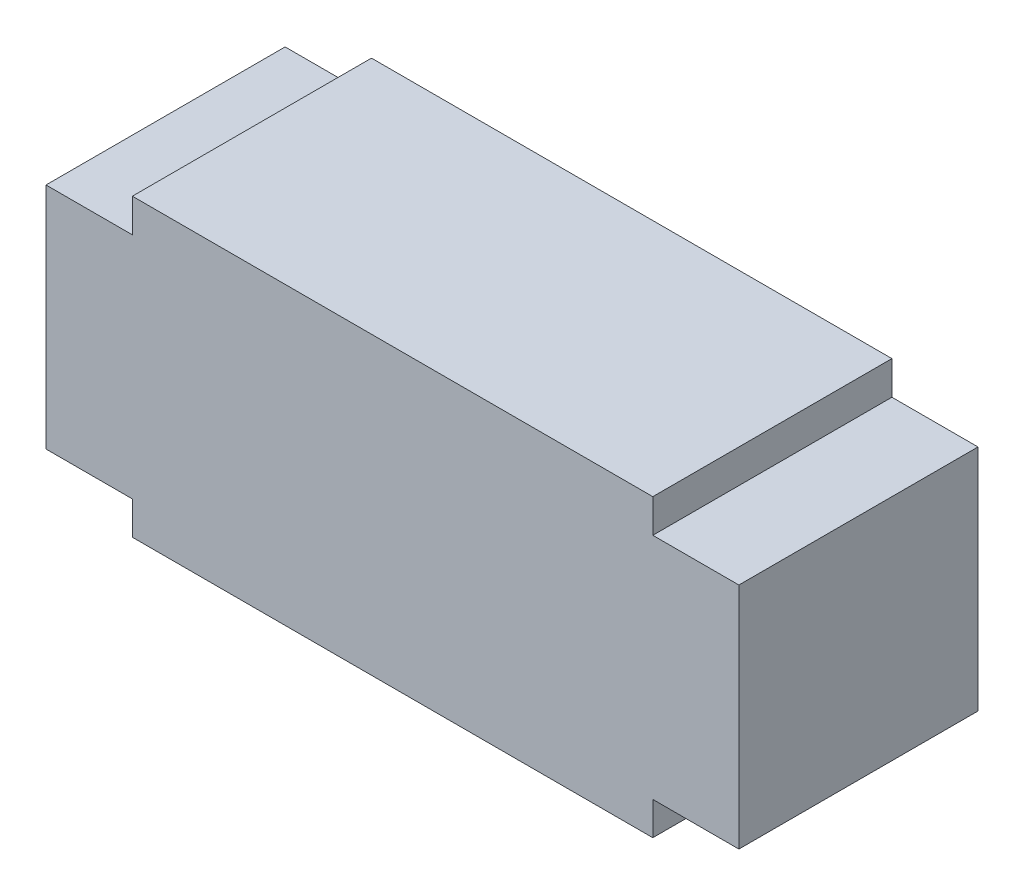
ISO-10303-21;
HEADER;
FILE_DESCRIPTION(('STEP AP214'),'2;1');
FILE_NAME('part.step','',(''),(''),'','','');
FILE_SCHEMA(('AUTOMOTIVE_DESIGN { 1 0 10303 214 1 1 1 1 }'));
ENDSEC;
DATA;
#1=APPLICATION_CONTEXT('core data for automotive mechanical design processes');
#2=APPLICATION_PROTOCOL_DEFINITION('international standard','automotive_design',2000,#1);
#3=PRODUCT_CONTEXT('',#1,'mechanical');
#4=PRODUCT('Part','Part','',(#3));
#5=PRODUCT_RELATED_PRODUCT_CATEGORY('part','',(#4));
#6=PRODUCT_DEFINITION_FORMATION('','',#4);
#7=PRODUCT_DEFINITION_CONTEXT('part definition',#1,'design');
#8=PRODUCT_DEFINITION('design','',#6,#7);
#9=PRODUCT_DEFINITION_SHAPE('','',#8);
#10=(LENGTH_UNIT() NAMED_UNIT(*) SI_UNIT(.MILLI.,.METRE.));
#11=(NAMED_UNIT(*) PLANE_ANGLE_UNIT() SI_UNIT($,.RADIAN.));
#12=(NAMED_UNIT(*) SI_UNIT($,.STERADIAN.) SOLID_ANGLE_UNIT());
#13=UNCERTAINTY_MEASURE_WITH_UNIT(LENGTH_MEASURE(1.E-05),#10,'distance_accuracy_value','');
#14=(GEOMETRIC_REPRESENTATION_CONTEXT(3) GLOBAL_UNCERTAINTY_ASSIGNED_CONTEXT((#13)) GLOBAL_UNIT_ASSIGNED_CONTEXT((#10,
#11,#12)) REPRESENTATION_CONTEXT('',''));
#15=CARTESIAN_POINT('',(0.,0.,0.));
#16=DIRECTION('',(0.,0.,1.));
#17=DIRECTION('',(1.,0.,0.));
#18=AXIS2_PLACEMENT_3D('',#15,#16,#17);
#19=CARTESIAN_POINT('',(0.,0.,0.849999999999902));
#20=DIRECTION('',(0.,0.,1.));
#21=DIRECTION('',(1.,0.,0.));
#22=AXIS2_PLACEMENT_3D('',#19,#20,#21);
#23=PLANE('',#22);
#24=DIRECTION('',(0.,1.,0.));
#25=VECTOR('',#24,1.);
#26=CARTESIAN_POINT('',(-0.92500000000011,-0.406999999999896,0.849999999999902));
#27=LINE('',#26,#25);
#28=CARTESIAN_POINT('',(-0.92500000000011,-0.524999999999932,0.849999999999902));
#29=VERTEX_POINT('',#28);
#30=CARTESIAN_POINT('',(-0.92500000000011,-0.406999999999896,0.849999999999902));
#31=VERTEX_POINT('',#30);
#32=EDGE_CURVE('E118',#29,#31,#27,.T.);
#33=ORIENTED_EDGE('',*,*,#32,.F.);
#34=DIRECTION('',(1.,0.,0.));
#35=VECTOR('',#34,1.);
#36=CARTESIAN_POINT('',(-0.92500000000011,-0.524999999999932,0.849999999999902));
#37=LINE('',#36,#35);
#38=CARTESIAN_POINT('',(0.92500000000011,-0.524999999999932,0.849999999999902));
#39=VERTEX_POINT('',#38);
#40=EDGE_CURVE('E20',#39,#29,#37,.F.);
#41=ORIENTED_EDGE('',*,*,#40,.F.);
#42=DIRECTION('',(0.,1.,0.));
#43=VECTOR('',#42,1.);
#44=CARTESIAN_POINT('',(0.92500000000011,-0.524999999999932,0.849999999999902));
#45=LINE('',#44,#43);
#46=CARTESIAN_POINT('',(0.92500000000011,-0.406999999999896,0.849999999999902));
#47=VERTEX_POINT('',#46);
#48=EDGE_CURVE('E107',#47,#39,#45,.F.);
#49=ORIENTED_EDGE('',*,*,#48,.F.);
#50=DIRECTION('',(1.,0.,0.));
#51=VECTOR('',#50,1.);
#52=CARTESIAN_POINT('',(0.92500000000011,-0.406999999999896,0.849999999999902));
#53=LINE('',#52,#51);
#54=CARTESIAN_POINT('',(1.2309999999999,-0.406999999999896,0.849999999999902));
#55=VERTEX_POINT('',#54);
#56=EDGE_CURVE('E102',#55,#47,#53,.F.);
#57=ORIENTED_EDGE('',*,*,#56,.F.);
#58=DIRECTION('',(0.,1.,0.));
#59=VECTOR('',#58,1.);
#60=CARTESIAN_POINT('',(1.2309999999999,-0.406999999999896,0.849999999999902));
#61=LINE('',#60,#59);
#62=CARTESIAN_POINT('',(1.2309999999999,0.4059999999999,0.849999999999902));
#63=VERTEX_POINT('',#62);
#64=EDGE_CURVE('E129',#63,#55,#61,.F.);
#65=ORIENTED_EDGE('',*,*,#64,.F.);
#66=DIRECTION('',(1.,0.,0.));
#67=VECTOR('',#66,1.);
#68=CARTESIAN_POINT('',(1.2309999999999,0.4059999999999,0.849999999999902));
#69=LINE('',#68,#67);
#70=CARTESIAN_POINT('',(0.92500000000011,0.4059999999999,0.849999999999902));
#71=VERTEX_POINT('',#70);
#72=EDGE_CURVE('E133',#71,#63,#69,.T.);
#73=ORIENTED_EDGE('',*,*,#72,.F.);
#74=DIRECTION('',(0.,1.,0.));
#75=VECTOR('',#74,1.);
#76=CARTESIAN_POINT('',(0.92500000000011,0.4059999999999,0.849999999999902));
#77=LINE('',#76,#75);
#78=CARTESIAN_POINT('',(0.92500000000011,0.524999999999932,0.849999999999902));
#79=VERTEX_POINT('',#78);
#80=EDGE_CURVE('E137',#79,#71,#77,.F.);
#81=ORIENTED_EDGE('',*,*,#80,.F.);
#82=DIRECTION('',(1.,0.,0.));
#83=VECTOR('',#82,1.);
#84=CARTESIAN_POINT('',(0.92500000000011,0.524999999999932,0.849999999999902));
#85=LINE('',#84,#83);
#86=CARTESIAN_POINT('',(-0.92500000000011,0.524999999999932,0.849999999999902));
#87=VERTEX_POINT('',#86);
#88=EDGE_CURVE('E141',#87,#79,#85,.T.);
#89=ORIENTED_EDGE('',*,*,#88,.F.);
#90=DIRECTION('',(0.,1.,0.));
#91=VECTOR('',#90,1.);
#92=CARTESIAN_POINT('',(-0.92500000000011,0.524999999999932,0.849999999999902));
#93=LINE('',#92,#91);
#94=CARTESIAN_POINT('',(-0.92500000000011,0.4059999999999,0.849999999999902));
#95=VERTEX_POINT('',#94);
#96=EDGE_CURVE('E145',#95,#87,#93,.T.);
#97=ORIENTED_EDGE('',*,*,#96,.F.);
#98=DIRECTION('',(1.,0.,0.));
#99=VECTOR('',#98,1.);
#100=CARTESIAN_POINT('',(-0.92500000000011,0.4059999999999,0.849999999999902));
#101=LINE('',#100,#99);
#102=CARTESIAN_POINT('',(-1.2319999999999,0.4059999999999,0.849999999999902));
#103=VERTEX_POINT('',#102);
#104=EDGE_CURVE('E149',#103,#95,#101,.T.);
#105=ORIENTED_EDGE('',*,*,#104,.F.);
#106=DIRECTION('',(0.,1.,0.));
#107=VECTOR('',#106,1.);
#108=CARTESIAN_POINT('',(-1.2319999999999,0.4059999999999,0.849999999999902));
#109=LINE('',#108,#107);
#110=CARTESIAN_POINT('',(-1.2319999999999,-0.406999999999896,0.849999999999902));
#111=VERTEX_POINT('',#110);
#112=EDGE_CURVE('E153',#111,#103,#109,.T.);
#113=ORIENTED_EDGE('',*,*,#112,.F.);
#114=DIRECTION('',(1.,0.,0.));
#115=VECTOR('',#114,1.);
#116=CARTESIAN_POINT('',(-1.2319999999999,-0.406999999999896,0.849999999999902));
#117=LINE('',#116,#115);
#118=EDGE_CURVE('E157',#31,#111,#117,.F.);
#119=ORIENTED_EDGE('',*,*,#118,.F.);
#120=EDGE_LOOP('',(#33,#41,#49,#57,#65,#73,#81,#89,#97,#105,#113,#119));
#121=FACE_BOUND('',#120,.T.);
#122=ADVANCED_FACE('F17',(#121),#23,.T.);
#123=CARTESIAN_POINT('',(-0.92500000000011,-0.524999999999932,0.));
#124=DIRECTION('',(0.,-1.,0.));
#125=DIRECTION('',(0.,0.,-1.));
#126=AXIS2_PLACEMENT_3D('',#123,#124,#125);
#127=PLANE('',#126);
#128=DIRECTION('',(0.,0.,1.));
#129=VECTOR('',#128,1.);
#130=CARTESIAN_POINT('',(-0.92500000000011,-0.524999999999932,0.));
#131=LINE('',#130,#129);
#132=CARTESIAN_POINT('',(-0.92500000000011,-0.524999999999932,0.));
#133=VERTEX_POINT('',#132);
#134=EDGE_CURVE('E161',#133,#29,#131,.T.);
#135=ORIENTED_EDGE('',*,*,#134,.F.);
#136=DIRECTION('',(1.,0.,0.));
#137=VECTOR('',#136,1.);
#138=CARTESIAN_POINT('',(0.,-0.524999999999932,0.));
#139=LINE('',#138,#137);
#140=CARTESIAN_POINT('',(0.92500000000011,-0.524999999999932,0.));
#141=VERTEX_POINT('',#140);
#142=EDGE_CURVE('E124',#133,#141,#139,.T.);
#143=ORIENTED_EDGE('',*,*,#142,.T.);
#144=DIRECTION('',(0.,0.,-1.));
#145=VECTOR('',#144,1.);
#146=CARTESIAN_POINT('',(0.92500000000011,-0.524999999999932,0.));
#147=LINE('',#146,#145);
#148=EDGE_CURVE('E112',#39,#141,#147,.T.);
#149=ORIENTED_EDGE('',*,*,#148,.F.);
#150=ORIENTED_EDGE('',*,*,#40,.T.);
#151=EDGE_LOOP('',(#135,#143,#149,#150));
#152=FACE_BOUND('',#151,.T.);
#153=ADVANCED_FACE('F123',(#152),#127,.T.);
#154=CARTESIAN_POINT('',(0.92500000000011,-0.524999999999932,0.));
#155=DIRECTION('',(1.,0.,0.));
#156=DIRECTION('',(0.,0.,-1.));
#157=AXIS2_PLACEMENT_3D('',#154,#155,#156);
#158=PLANE('',#157);
#159=ORIENTED_EDGE('',*,*,#148,.T.);
#160=DIRECTION('',(0.,1.,0.));
#161=VECTOR('',#160,1.);
#162=CARTESIAN_POINT('',(0.92500000000011,0.,0.));
#163=LINE('',#162,#161);
#164=CARTESIAN_POINT('',(0.92500000000011,-0.406999999999896,0.));
#165=VERTEX_POINT('',#164);
#166=EDGE_CURVE('E166',#141,#165,#163,.T.);
#167=ORIENTED_EDGE('',*,*,#166,.T.);
#168=DIRECTION('',(0.,0.,-1.));
#169=VECTOR('',#168,1.);
#170=CARTESIAN_POINT('',(0.92500000000011,-0.406999999999896,0.));
#171=LINE('',#170,#169);
#172=EDGE_CURVE('E114',#47,#165,#171,.T.);
#173=ORIENTED_EDGE('',*,*,#172,.F.);
#174=ORIENTED_EDGE('',*,*,#48,.T.);
#175=EDGE_LOOP('',(#159,#167,#173,#174));
#176=FACE_BOUND('',#175,.T.);
#177=ADVANCED_FACE('F109',(#176),#158,.T.);
#178=CARTESIAN_POINT('',(0.92500000000011,-0.406999999999896,0.));
#179=DIRECTION('',(0.,-1.,0.));
#180=DIRECTION('',(0.,0.,-1.));
#181=AXIS2_PLACEMENT_3D('',#178,#179,#180);
#182=PLANE('',#181);
#183=ORIENTED_EDGE('',*,*,#172,.T.);
#184=DIRECTION('',(1.,0.,0.));
#185=VECTOR('',#184,1.);
#186=CARTESIAN_POINT('',(0.,-0.406999999999896,0.));
#187=LINE('',#186,#185);
#188=CARTESIAN_POINT('',(1.2309999999999,-0.406999999999896,0.));
#189=VERTEX_POINT('',#188);
#190=EDGE_CURVE('E168',#165,#189,#187,.T.);
#191=ORIENTED_EDGE('',*,*,#190,.T.);
#192=DIRECTION('',(0.,0.,-1.));
#193=VECTOR('',#192,1.);
#194=CARTESIAN_POINT('',(1.2309999999999,-0.406999999999896,0.));
#195=LINE('',#194,#193);
#196=EDGE_CURVE('E131',#55,#189,#195,.T.);
#197=ORIENTED_EDGE('',*,*,#196,.F.);
#198=ORIENTED_EDGE('',*,*,#56,.T.);
#199=EDGE_LOOP('',(#183,#191,#197,#198));
#200=FACE_BOUND('',#199,.T.);
#201=ADVANCED_FACE('F234',(#200),#182,.T.);
#202=CARTESIAN_POINT('',(1.2309999999999,-0.406999999999896,0.));
#203=DIRECTION('',(1.,0.,0.));
#204=DIRECTION('',(0.,0.,-1.));
#205=AXIS2_PLACEMENT_3D('',#202,#203,#204);
#206=PLANE('',#205);
#207=ORIENTED_EDGE('',*,*,#196,.T.);
#208=DIRECTION('',(0.,1.,0.));
#209=VECTOR('',#208,1.);
#210=CARTESIAN_POINT('',(1.2309999999999,0.,0.));
#211=LINE('',#210,#209);
#212=CARTESIAN_POINT('',(1.2309999999999,0.4059999999999,0.));
#213=VERTEX_POINT('',#212);
#214=EDGE_CURVE('E171',#189,#213,#211,.T.);
#215=ORIENTED_EDGE('',*,*,#214,.T.);
#216=DIRECTION('',(0.,0.,1.));
#217=VECTOR('',#216,1.);
#218=CARTESIAN_POINT('',(1.2309999999999,0.4059999999999,0.));
#219=LINE('',#218,#217);
#220=EDGE_CURVE('E135',#63,#213,#219,.F.);
#221=ORIENTED_EDGE('',*,*,#220,.F.);
#222=ORIENTED_EDGE('',*,*,#64,.T.);
#223=EDGE_LOOP('',(#207,#215,#221,#222));
#224=FACE_BOUND('',#223,.T.);
#225=ADVANCED_FACE('F233',(#224),#206,.T.);
#226=CARTESIAN_POINT('',(1.2309999999999,0.4059999999999,0.));
#227=DIRECTION('',(0.,1.,0.));
#228=DIRECTION('',(0.,0.,1.));
#229=AXIS2_PLACEMENT_3D('',#226,#227,#228);
#230=PLANE('',#229);
#231=ORIENTED_EDGE('',*,*,#220,.T.);
#232=DIRECTION('',(1.,0.,0.));
#233=VECTOR('',#232,1.);
#234=CARTESIAN_POINT('',(0.,0.4059999999999,0.));
#235=LINE('',#234,#233);
#236=CARTESIAN_POINT('',(0.92500000000011,0.4059999999999,0.));
#237=VERTEX_POINT('',#236);
#238=EDGE_CURVE('E174',#213,#237,#235,.F.);
#239=ORIENTED_EDGE('',*,*,#238,.T.);
#240=DIRECTION('',(0.,0.,-1.));
#241=VECTOR('',#240,1.);
#242=CARTESIAN_POINT('',(0.92500000000011,0.4059999999999,0.));
#243=LINE('',#242,#241);
#244=EDGE_CURVE('E139',#71,#237,#243,.T.);
#245=ORIENTED_EDGE('',*,*,#244,.F.);
#246=ORIENTED_EDGE('',*,*,#72,.T.);
#247=EDGE_LOOP('',(#231,#239,#245,#246));
#248=FACE_BOUND('',#247,.T.);
#249=ADVANCED_FACE('F227',(#248),#230,.T.);
#250=CARTESIAN_POINT('',(0.92500000000011,0.4059999999999,0.));
#251=DIRECTION('',(1.,0.,0.));
#252=DIRECTION('',(0.,0.,-1.));
#253=AXIS2_PLACEMENT_3D('',#250,#251,#252);
#254=PLANE('',#253);
#255=ORIENTED_EDGE('',*,*,#244,.T.);
#256=DIRECTION('',(0.,1.,0.));
#257=VECTOR('',#256,1.);
#258=CARTESIAN_POINT('',(0.92500000000011,0.,0.));
#259=LINE('',#258,#257);
#260=CARTESIAN_POINT('',(0.92500000000011,0.524999999999932,0.));
#261=VERTEX_POINT('',#260);
#262=EDGE_CURVE('E177',#237,#261,#259,.T.);
#263=ORIENTED_EDGE('',*,*,#262,.T.);
#264=DIRECTION('',(0.,0.,1.));
#265=VECTOR('',#264,1.);
#266=CARTESIAN_POINT('',(0.92500000000011,0.524999999999932,0.));
#267=LINE('',#266,#265);
#268=EDGE_CURVE('E143',#79,#261,#267,.F.);
#269=ORIENTED_EDGE('',*,*,#268,.F.);
#270=ORIENTED_EDGE('',*,*,#80,.T.);
#271=EDGE_LOOP('',(#255,#263,#269,#270));
#272=FACE_BOUND('',#271,.T.);
#273=ADVANCED_FACE('F223',(#272),#254,.T.);
#274=CARTESIAN_POINT('',(0.92500000000011,0.524999999999932,0.));
#275=DIRECTION('',(0.,1.,0.));
#276=DIRECTION('',(0.,0.,1.));
#277=AXIS2_PLACEMENT_3D('',#274,#275,#276);
#278=PLANE('',#277);
#279=ORIENTED_EDGE('',*,*,#268,.T.);
#280=DIRECTION('',(1.,0.,0.));
#281=VECTOR('',#280,1.);
#282=CARTESIAN_POINT('',(0.,0.524999999999932,0.));
#283=LINE('',#282,#281);
#284=CARTESIAN_POINT('',(-0.92500000000011,0.524999999999932,0.));
#285=VERTEX_POINT('',#284);
#286=EDGE_CURVE('E180',#261,#285,#283,.F.);
#287=ORIENTED_EDGE('',*,*,#286,.T.);
#288=DIRECTION('',(0.,0.,1.));
#289=VECTOR('',#288,1.);
#290=CARTESIAN_POINT('',(-0.92500000000011,0.524999999999932,0.));
#291=LINE('',#290,#289);
#292=EDGE_CURVE('E147',#87,#285,#291,.F.);
#293=ORIENTED_EDGE('',*,*,#292,.F.);
#294=ORIENTED_EDGE('',*,*,#88,.T.);
#295=EDGE_LOOP('',(#279,#287,#293,#294));
#296=FACE_BOUND('',#295,.T.);
#297=ADVANCED_FACE('F217',(#296),#278,.T.);
#298=CARTESIAN_POINT('',(-0.92500000000011,0.524999999999932,0.));
#299=DIRECTION('',(-1.,0.,0.));
#300=DIRECTION('',(0.,0.,1.));
#301=AXIS2_PLACEMENT_3D('',#298,#299,#300);
#302=PLANE('',#301);
#303=ORIENTED_EDGE('',*,*,#292,.T.);
#304=DIRECTION('',(0.,1.,0.));
#305=VECTOR('',#304,1.);
#306=CARTESIAN_POINT('',(-0.92500000000011,0.,0.));
#307=LINE('',#306,#305);
#308=CARTESIAN_POINT('',(-0.92500000000011,0.4059999999999,0.));
#309=VERTEX_POINT('',#308);
#310=EDGE_CURVE('E183',#285,#309,#307,.F.);
#311=ORIENTED_EDGE('',*,*,#310,.T.);
#312=DIRECTION('',(0.,0.,1.));
#313=VECTOR('',#312,1.);
#314=CARTESIAN_POINT('',(-0.92500000000011,0.4059999999999,0.));
#315=LINE('',#314,#313);
#316=EDGE_CURVE('E151',#95,#309,#315,.F.);
#317=ORIENTED_EDGE('',*,*,#316,.F.);
#318=ORIENTED_EDGE('',*,*,#96,.T.);
#319=EDGE_LOOP('',(#303,#311,#317,#318));
#320=FACE_BOUND('',#319,.T.);
#321=ADVANCED_FACE('F213',(#320),#302,.T.);
#322=CARTESIAN_POINT('',(-0.92500000000011,0.4059999999999,0.));
#323=DIRECTION('',(0.,1.,0.));
#324=DIRECTION('',(0.,0.,1.));
#325=AXIS2_PLACEMENT_3D('',#322,#323,#324);
#326=PLANE('',#325);
#327=ORIENTED_EDGE('',*,*,#316,.T.);
#328=DIRECTION('',(1.,0.,0.));
#329=VECTOR('',#328,1.);
#330=CARTESIAN_POINT('',(0.,0.4059999999999,0.));
#331=LINE('',#330,#329);
#332=CARTESIAN_POINT('',(-1.2319999999999,0.4059999999999,0.));
#333=VERTEX_POINT('',#332);
#334=EDGE_CURVE('E186',#309,#333,#331,.F.);
#335=ORIENTED_EDGE('',*,*,#334,.T.);
#336=DIRECTION('',(0.,0.,1.));
#337=VECTOR('',#336,1.);
#338=CARTESIAN_POINT('',(-1.2319999999999,0.4059999999999,0.));
#339=LINE('',#338,#337);
#340=EDGE_CURVE('E155',#103,#333,#339,.F.);
#341=ORIENTED_EDGE('',*,*,#340,.F.);
#342=ORIENTED_EDGE('',*,*,#104,.T.);
#343=EDGE_LOOP('',(#327,#335,#341,#342));
#344=FACE_BOUND('',#343,.T.);
#345=ADVANCED_FACE('F207',(#344),#326,.T.);
#346=CARTESIAN_POINT('',(-1.2319999999999,0.4059999999999,0.));
#347=DIRECTION('',(-1.,0.,0.));
#348=DIRECTION('',(0.,0.,1.));
#349=AXIS2_PLACEMENT_3D('',#346,#347,#348);
#350=PLANE('',#349);
#351=ORIENTED_EDGE('',*,*,#340,.T.);
#352=DIRECTION('',(0.,1.,0.));
#353=VECTOR('',#352,1.);
#354=CARTESIAN_POINT('',(-1.2319999999999,0.,0.));
#355=LINE('',#354,#353);
#356=CARTESIAN_POINT('',(-1.2319999999999,-0.406999999999896,0.));
#357=VERTEX_POINT('',#356);
#358=EDGE_CURVE('E189',#333,#357,#355,.F.);
#359=ORIENTED_EDGE('',*,*,#358,.T.);
#360=DIRECTION('',(0.,0.,-1.));
#361=VECTOR('',#360,1.);
#362=CARTESIAN_POINT('',(-1.2319999999999,-0.406999999999896,0.));
#363=LINE('',#362,#361);
#364=EDGE_CURVE('E159',#111,#357,#363,.T.);
#365=ORIENTED_EDGE('',*,*,#364,.F.);
#366=ORIENTED_EDGE('',*,*,#112,.T.);
#367=EDGE_LOOP('',(#351,#359,#365,#366));
#368=FACE_BOUND('',#367,.T.);
#369=ADVANCED_FACE('F202',(#368),#350,.T.);
#370=CARTESIAN_POINT('',(-1.2319999999999,-0.406999999999896,0.));
#371=DIRECTION('',(0.,-1.,0.));
#372=DIRECTION('',(0.,0.,-1.));
#373=AXIS2_PLACEMENT_3D('',#370,#371,#372);
#374=PLANE('',#373);
#375=ORIENTED_EDGE('',*,*,#364,.T.);
#376=DIRECTION('',(1.,0.,0.));
#377=VECTOR('',#376,1.);
#378=CARTESIAN_POINT('',(0.,-0.406999999999896,0.));
#379=LINE('',#378,#377);
#380=CARTESIAN_POINT('',(-0.92500000000011,-0.406999999999896,0.));
#381=VERTEX_POINT('',#380);
#382=EDGE_CURVE('E26',#357,#381,#379,.T.);
#383=ORIENTED_EDGE('',*,*,#382,.T.);
#384=DIRECTION('',(0.,0.,1.));
#385=VECTOR('',#384,1.);
#386=CARTESIAN_POINT('',(-0.92500000000011,-0.406999999999896,0.));
#387=LINE('',#386,#385);
#388=EDGE_CURVE('E34',#31,#381,#387,.F.);
#389=ORIENTED_EDGE('',*,*,#388,.F.);
#390=ORIENTED_EDGE('',*,*,#118,.T.);
#391=EDGE_LOOP('',(#375,#383,#389,#390));
#392=FACE_BOUND('',#391,.T.);
#393=ADVANCED_FACE('F195',(#392),#374,.T.);
#394=CARTESIAN_POINT('',(-0.92500000000011,-0.406999999999896,0.));
#395=DIRECTION('',(-1.,0.,0.));
#396=DIRECTION('',(0.,0.,1.));
#397=AXIS2_PLACEMENT_3D('',#394,#395,#396);
#398=PLANE('',#397);
#399=ORIENTED_EDGE('',*,*,#388,.T.);
#400=DIRECTION('',(0.,1.,0.));
#401=VECTOR('',#400,1.);
#402=CARTESIAN_POINT('',(-0.92500000000011,0.,0.));
#403=LINE('',#402,#401);
#404=EDGE_CURVE('E11',#381,#133,#403,.F.);
#405=ORIENTED_EDGE('',*,*,#404,.T.);
#406=ORIENTED_EDGE('',*,*,#134,.T.);
#407=ORIENTED_EDGE('',*,*,#32,.T.);
#408=EDGE_LOOP('',(#399,#405,#406,#407));
#409=FACE_BOUND('',#408,.T.);
#410=ADVANCED_FACE('F235',(#409),#398,.T.);
#411=CARTESIAN_POINT('',(0.,0.,0.));
#412=DIRECTION('',(0.,0.,1.));
#413=DIRECTION('',(1.,0.,0.));
#414=AXIS2_PLACEMENT_3D('',#411,#412,#413);
#415=PLANE('',#414);
#416=ORIENTED_EDGE('',*,*,#382,.F.);
#417=ORIENTED_EDGE('',*,*,#358,.F.);
#418=ORIENTED_EDGE('',*,*,#334,.F.);
#419=ORIENTED_EDGE('',*,*,#310,.F.);
#420=ORIENTED_EDGE('',*,*,#286,.F.);
#421=ORIENTED_EDGE('',*,*,#262,.F.);
#422=ORIENTED_EDGE('',*,*,#238,.F.);
#423=ORIENTED_EDGE('',*,*,#214,.F.);
#424=ORIENTED_EDGE('',*,*,#190,.F.);
#425=ORIENTED_EDGE('',*,*,#166,.F.);
#426=ORIENTED_EDGE('',*,*,#142,.F.);
#427=ORIENTED_EDGE('',*,*,#404,.F.);
#428=EDGE_LOOP('',(#416,#417,#418,#419,#420,#421,#422,#423,#424,#425,#426,#427));
#429=FACE_BOUND('',#428,.T.);
#430=ADVANCED_FACE('F199',(#429),#415,.F.);
#431=CLOSED_SHELL('',(#122,#153,#177,#201,#225,#249,#273,#297,#321,#345,#369,#393,#410,#430));
#432=MANIFOLD_SOLID_BREP('B1',#431);
#433=ADVANCED_BREP_SHAPE_REPRESENTATION('',(#18,#432),#14);
#434=SHAPE_DEFINITION_REPRESENTATION(#9,#433);
ENDSEC;
END-ISO-10303-21;
